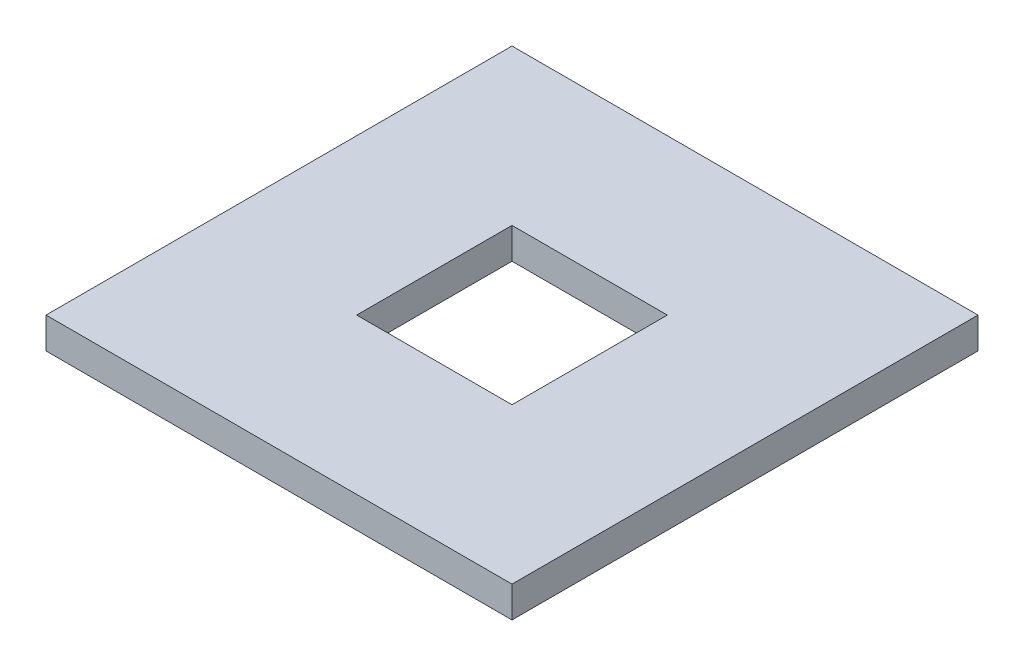
ISO-10303-21;
HEADER;
FILE_DESCRIPTION(('STEP AP214'),'2;1');
FILE_NAME('part.step','',(''),(''),'','','');
FILE_SCHEMA(('AUTOMOTIVE_DESIGN { 1 0 10303 214 1 1 1 1 }'));
ENDSEC;
DATA;
#1=APPLICATION_CONTEXT('core data for automotive mechanical design processes');
#2=APPLICATION_PROTOCOL_DEFINITION('international standard','automotive_design',2000,#1);
#3=PRODUCT_CONTEXT('',#1,'mechanical');
#4=PRODUCT('Part','Part','',(#3));
#5=PRODUCT_RELATED_PRODUCT_CATEGORY('part','',(#4));
#6=PRODUCT_DEFINITION_FORMATION('','',#4);
#7=PRODUCT_DEFINITION_CONTEXT('part definition',#1,'design');
#8=PRODUCT_DEFINITION('design','',#6,#7);
#9=PRODUCT_DEFINITION_SHAPE('','',#8);
#10=(LENGTH_UNIT() NAMED_UNIT(*) SI_UNIT(.MILLI.,.METRE.));
#11=(NAMED_UNIT(*) PLANE_ANGLE_UNIT() SI_UNIT($,.RADIAN.));
#12=(NAMED_UNIT(*) SI_UNIT($,.STERADIAN.) SOLID_ANGLE_UNIT());
#13=UNCERTAINTY_MEASURE_WITH_UNIT(LENGTH_MEASURE(1.E-05),#10,'distance_accuracy_value','');
#14=(GEOMETRIC_REPRESENTATION_CONTEXT(3) GLOBAL_UNCERTAINTY_ASSIGNED_CONTEXT((#13)) GLOBAL_UNIT_ASSIGNED_CONTEXT((#10,
#11,#12)) REPRESENTATION_CONTEXT('',''));
#15=CARTESIAN_POINT('',(0.,0.,0.));
#16=DIRECTION('',(0.,0.,1.));
#17=DIRECTION('',(1.,0.,0.));
#18=AXIS2_PLACEMENT_3D('',#15,#16,#17);
#19=CARTESIAN_POINT('',(0.,100.,-1000.));
#20=DIRECTION('',(0.,0.,-1.));
#21=DIRECTION('',(-1.,0.,0.));
#22=AXIS2_PLACEMENT_3D('',#19,#20,#21);
#23=PLANE('',#22);
#24=DIRECTION('',(1.,0.,0.));
#25=VECTOR('',#24,1.);
#26=CARTESIAN_POINT('',(0.,0.,-1000.));
#27=LINE('',#26,#25);
#28=CARTESIAN_POINT('',(500.,0.,-1000.));
#29=VERTEX_POINT('',#28);
#30=CARTESIAN_POINT('',(1000.,0.,-1000.));
#31=VERTEX_POINT('',#30);
#32=EDGE_CURVE('E146',#29,#31,#27,.T.);
#33=ORIENTED_EDGE('',*,*,#32,.T.);
#34=DIRECTION('',(0.,-1.,0.));
#35=VECTOR('',#34,1.);
#36=CARTESIAN_POINT('',(1000.,100.,-1000.));
#37=LINE('',#36,#35);
#38=CARTESIAN_POINT('',(1000.,100.,-1000.));
#39=VERTEX_POINT('',#38);
#40=EDGE_CURVE('E11',#39,#31,#37,.T.);
#41=ORIENTED_EDGE('',*,*,#40,.F.);
#42=DIRECTION('',(1.,0.,0.));
#43=VECTOR('',#42,1.);
#44=CARTESIAN_POINT('',(0.,100.,-1000.));
#45=LINE('',#44,#43);
#46=CARTESIAN_POINT('',(500.,100.,-1000.));
#47=VERTEX_POINT('',#46);
#48=EDGE_CURVE('E117',#47,#39,#45,.T.);
#49=ORIENTED_EDGE('',*,*,#48,.F.);
#50=DIRECTION('',(0.,-1.,0.));
#51=VECTOR('',#50,1.);
#52=CARTESIAN_POINT('',(500.,100.,-1000.));
#53=LINE('',#52,#51);
#54=EDGE_CURVE('E56',#47,#29,#53,.T.);
#55=ORIENTED_EDGE('',*,*,#54,.T.);
#56=EDGE_LOOP('',(#33,#41,#49,#55));
#57=FACE_BOUND('',#56,.T.);
#58=ADVANCED_FACE('F37',(#57),#23,.F.);
#59=CARTESIAN_POINT('',(1000.,100.,0.));
#60=DIRECTION('',(1.,0.,0.));
#61=DIRECTION('',(0.,0.,-1.));
#62=AXIS2_PLACEMENT_3D('',#59,#60,#61);
#63=PLANE('',#62);
#64=DIRECTION('',(0.,0.,1.));
#65=VECTOR('',#64,1.);
#66=CARTESIAN_POINT('',(1000.,0.,0.));
#67=LINE('',#66,#65);
#68=CARTESIAN_POINT('',(1000.,0.,-500.));
#69=VERTEX_POINT('',#68);
#70=EDGE_CURVE('E123',#31,#69,#67,.T.);
#71=ORIENTED_EDGE('',*,*,#70,.T.);
#72=DIRECTION('',(0.,-1.,0.));
#73=VECTOR('',#72,1.);
#74=CARTESIAN_POINT('',(1000.,100.,-500.));
#75=LINE('',#74,#73);
#76=CARTESIAN_POINT('',(1000.,100.,-500.));
#77=VERTEX_POINT('',#76);
#78=EDGE_CURVE('E47',#77,#69,#75,.T.);
#79=ORIENTED_EDGE('',*,*,#78,.F.);
#80=DIRECTION('',(0.,0.,1.));
#81=VECTOR('',#80,1.);
#82=CARTESIAN_POINT('',(1000.,100.,0.));
#83=LINE('',#82,#81);
#84=EDGE_CURVE('E111',#39,#77,#83,.T.);
#85=ORIENTED_EDGE('',*,*,#84,.F.);
#86=ORIENTED_EDGE('',*,*,#40,.T.);
#87=EDGE_LOOP('',(#71,#79,#85,#86));
#88=FACE_BOUND('',#87,.T.);
#89=ADVANCED_FACE('F122',(#88),#63,.F.);
#90=CARTESIAN_POINT('',(0.,100.,-500.));
#91=DIRECTION('',(0.,0.,-1.));
#92=DIRECTION('',(-1.,0.,0.));
#93=AXIS2_PLACEMENT_3D('',#90,#91,#92);
#94=PLANE('',#93);
#95=DIRECTION('',(1.,0.,0.));
#96=VECTOR('',#95,1.);
#97=CARTESIAN_POINT('',(0.,0.,-500.));
#98=LINE('',#97,#96);
#99=CARTESIAN_POINT('',(500.,0.,-500.));
#100=VERTEX_POINT('',#99);
#101=EDGE_CURVE('E149',#100,#69,#98,.T.);
#102=ORIENTED_EDGE('',*,*,#101,.F.);
#103=DIRECTION('',(0.,-1.,0.));
#104=VECTOR('',#103,1.);
#105=CARTESIAN_POINT('',(500.,100.,-500.));
#106=LINE('',#105,#104);
#107=CARTESIAN_POINT('',(500.,100.,-500.));
#108=VERTEX_POINT('',#107);
#109=EDGE_CURVE('E82',#108,#100,#106,.T.);
#110=ORIENTED_EDGE('',*,*,#109,.F.);
#111=DIRECTION('',(1.,0.,0.));
#112=VECTOR('',#111,1.);
#113=CARTESIAN_POINT('',(0.,100.,-500.));
#114=LINE('',#113,#112);
#115=EDGE_CURVE('E116',#108,#77,#114,.T.);
#116=ORIENTED_EDGE('',*,*,#115,.T.);
#117=ORIENTED_EDGE('',*,*,#78,.T.);
#118=EDGE_LOOP('',(#102,#110,#116,#117));
#119=FACE_BOUND('',#118,.T.);
#120=ADVANCED_FACE('F127',(#119),#94,.T.);
#121=CARTESIAN_POINT('',(0.,100.,0.));
#122=DIRECTION('',(0.,0.,-1.));
#123=DIRECTION('',(-1.,0.,0.));
#124=AXIS2_PLACEMENT_3D('',#121,#122,#123);
#125=PLANE('',#124);
#126=DIRECTION('',(1.,0.,0.));
#127=VECTOR('',#126,1.);
#128=CARTESIAN_POINT('',(0.,0.,0.));
#129=LINE('',#128,#127);
#130=CARTESIAN_POINT('',(0.,0.,0.));
#131=VERTEX_POINT('',#130);
#132=CARTESIAN_POINT('',(1500.,0.,0.));
#133=VERTEX_POINT('',#132);
#134=EDGE_CURVE('E134',#131,#133,#129,.T.);
#135=ORIENTED_EDGE('',*,*,#134,.T.);
#136=DIRECTION('',(0.,-1.,0.));
#137=VECTOR('',#136,1.);
#138=CARTESIAN_POINT('',(1500.,100.,0.));
#139=LINE('',#138,#137);
#140=CARTESIAN_POINT('',(1500.,100.,0.));
#141=VERTEX_POINT('',#140);
#142=EDGE_CURVE('E41',#141,#133,#139,.T.);
#143=ORIENTED_EDGE('',*,*,#142,.F.);
#144=DIRECTION('',(1.,0.,0.));
#145=VECTOR('',#144,1.);
#146=CARTESIAN_POINT('',(0.,100.,0.));
#147=LINE('',#146,#145);
#148=CARTESIAN_POINT('',(0.,100.,0.));
#149=VERTEX_POINT('',#148);
#150=EDGE_CURVE('E154',#149,#141,#147,.T.);
#151=ORIENTED_EDGE('',*,*,#150,.F.);
#152=DIRECTION('',(0.,-1.,0.));
#153=VECTOR('',#152,1.);
#154=CARTESIAN_POINT('',(0.,100.,0.));
#155=LINE('',#154,#153);
#156=EDGE_CURVE('E130',#149,#131,#155,.T.);
#157=ORIENTED_EDGE('',*,*,#156,.T.);
#158=EDGE_LOOP('',(#135,#143,#151,#157));
#159=FACE_BOUND('',#158,.T.);
#160=ADVANCED_FACE('F39',(#159),#125,.F.);
#161=CARTESIAN_POINT('',(1500.,100.,0.));
#162=DIRECTION('',(-1.,0.,0.));
#163=DIRECTION('',(0.,0.,1.));
#164=AXIS2_PLACEMENT_3D('',#161,#162,#163);
#165=PLANE('',#164);
#166=DIRECTION('',(0.,0.,-1.));
#167=VECTOR('',#166,1.);
#168=CARTESIAN_POINT('',(1500.,0.,0.));
#169=LINE('',#168,#167);
#170=CARTESIAN_POINT('',(1500.,0.,-1500.));
#171=VERTEX_POINT('',#170);
#172=EDGE_CURVE('E137',#133,#171,#169,.T.);
#173=ORIENTED_EDGE('',*,*,#172,.T.);
#174=DIRECTION('',(0.,-1.,0.));
#175=VECTOR('',#174,1.);
#176=CARTESIAN_POINT('',(1500.,100.,-1500.));
#177=LINE('',#176,#175);
#178=CARTESIAN_POINT('',(1500.,100.,-1500.));
#179=VERTEX_POINT('',#178);
#180=EDGE_CURVE('E159',#179,#171,#177,.T.);
#181=ORIENTED_EDGE('',*,*,#180,.F.);
#182=DIRECTION('',(0.,0.,-1.));
#183=VECTOR('',#182,1.);
#184=CARTESIAN_POINT('',(1500.,100.,0.));
#185=LINE('',#184,#183);
#186=EDGE_CURVE('E95',#141,#179,#185,.T.);
#187=ORIENTED_EDGE('',*,*,#186,.F.);
#188=ORIENTED_EDGE('',*,*,#142,.T.);
#189=EDGE_LOOP('',(#173,#181,#187,#188));
#190=FACE_BOUND('',#189,.T.);
#191=ADVANCED_FACE('F164',(#190),#165,.F.);
#192=CARTESIAN_POINT('',(0.,100.,-1500.));
#193=DIRECTION('',(0.,0.,-1.));
#194=DIRECTION('',(-1.,0.,0.));
#195=AXIS2_PLACEMENT_3D('',#192,#193,#194);
#196=PLANE('',#195);
#197=DIRECTION('',(1.,0.,0.));
#198=VECTOR('',#197,1.);
#199=CARTESIAN_POINT('',(0.,0.,-1500.));
#200=LINE('',#199,#198);
#201=CARTESIAN_POINT('',(0.,0.,-1500.));
#202=VERTEX_POINT('',#201);
#203=EDGE_CURVE('E140',#202,#171,#200,.T.);
#204=ORIENTED_EDGE('',*,*,#203,.F.);
#205=DIRECTION('',(0.,-1.,0.));
#206=VECTOR('',#205,1.);
#207=CARTESIAN_POINT('',(0.,100.,-1500.));
#208=LINE('',#207,#206);
#209=CARTESIAN_POINT('',(0.,100.,-1500.));
#210=VERTEX_POINT('',#209);
#211=EDGE_CURVE('E158',#210,#202,#208,.T.);
#212=ORIENTED_EDGE('',*,*,#211,.F.);
#213=DIRECTION('',(1.,0.,0.));
#214=VECTOR('',#213,1.);
#215=CARTESIAN_POINT('',(0.,100.,-1500.));
#216=LINE('',#215,#214);
#217=EDGE_CURVE('E205',#210,#179,#216,.T.);
#218=ORIENTED_EDGE('',*,*,#217,.T.);
#219=ORIENTED_EDGE('',*,*,#180,.T.);
#220=EDGE_LOOP('',(#204,#212,#218,#219));
#221=FACE_BOUND('',#220,.T.);
#222=ADVANCED_FACE('F178',(#221),#196,.T.);
#223=CARTESIAN_POINT('',(0.,100.,0.));
#224=DIRECTION('',(-1.,0.,0.));
#225=DIRECTION('',(0.,0.,1.));
#226=AXIS2_PLACEMENT_3D('',#223,#224,#225);
#227=PLANE('',#226);
#228=DIRECTION('',(0.,0.,-1.));
#229=VECTOR('',#228,1.);
#230=CARTESIAN_POINT('',(0.,0.,0.));
#231=LINE('',#230,#229);
#232=EDGE_CURVE('E143',#131,#202,#231,.T.);
#233=ORIENTED_EDGE('',*,*,#232,.F.);
#234=ORIENTED_EDGE('',*,*,#156,.F.);
#235=DIRECTION('',(0.,0.,-1.));
#236=VECTOR('',#235,1.);
#237=CARTESIAN_POINT('',(0.,100.,0.));
#238=LINE('',#237,#236);
#239=EDGE_CURVE('E176',#149,#210,#238,.T.);
#240=ORIENTED_EDGE('',*,*,#239,.T.);
#241=ORIENTED_EDGE('',*,*,#211,.T.);
#242=EDGE_LOOP('',(#233,#234,#240,#241));
#243=FACE_BOUND('',#242,.T.);
#244=ADVANCED_FACE('F173',(#243),#227,.T.);
#245=CARTESIAN_POINT('',(500.,100.,-2.22044604925031E-13));
#246=DIRECTION('',(1.,0.,0.));
#247=DIRECTION('',(0.,0.,-1.));
#248=AXIS2_PLACEMENT_3D('',#245,#246,#247);
#249=PLANE('',#248);
#250=DIRECTION('',(0.,0.,1.));
#251=VECTOR('',#250,1.);
#252=CARTESIAN_POINT('',(500.,0.,-2.22044604925031E-13));
#253=LINE('',#252,#251);
#254=EDGE_CURVE('E151',#29,#100,#253,.T.);
#255=ORIENTED_EDGE('',*,*,#254,.F.);
#256=ORIENTED_EDGE('',*,*,#54,.F.);
#257=DIRECTION('',(0.,0.,1.));
#258=VECTOR('',#257,1.);
#259=CARTESIAN_POINT('',(500.,100.,-2.22044604925031E-13));
#260=LINE('',#259,#258);
#261=EDGE_CURVE('E128',#47,#108,#260,.T.);
#262=ORIENTED_EDGE('',*,*,#261,.T.);
#263=ORIENTED_EDGE('',*,*,#109,.T.);
#264=EDGE_LOOP('',(#255,#256,#262,#263));
#265=FACE_BOUND('',#264,.T.);
#266=ADVANCED_FACE('F185',(#265),#249,.T.);
#267=CARTESIAN_POINT('',(0.,100.,0.));
#268=DIRECTION('',(0.,1.,0.));
#269=DIRECTION('',(0.,0.,1.));
#270=AXIS2_PLACEMENT_3D('',#267,#268,#269);
#271=PLANE('',#270);
#272=ORIENTED_EDGE('',*,*,#150,.T.);
#273=ORIENTED_EDGE('',*,*,#186,.T.);
#274=ORIENTED_EDGE('',*,*,#217,.F.);
#275=ORIENTED_EDGE('',*,*,#239,.F.);
#276=EDGE_LOOP('',(#272,#273,#274,#275));
#277=FACE_BOUND('',#276,.T.);
#278=ORIENTED_EDGE('',*,*,#48,.T.);
#279=ORIENTED_EDGE('',*,*,#84,.T.);
#280=ORIENTED_EDGE('',*,*,#115,.F.);
#281=ORIENTED_EDGE('',*,*,#261,.F.);
#282=EDGE_LOOP('',(#278,#279,#280,#281));
#283=FACE_BOUND('',#282,.T.);
#284=ADVANCED_FACE('F113',(#277,#283),#271,.T.);
#285=CARTESIAN_POINT('',(0.,0.,0.));
#286=DIRECTION('',(0.,1.,0.));
#287=DIRECTION('',(0.,0.,1.));
#288=AXIS2_PLACEMENT_3D('',#285,#286,#287);
#289=PLANE('',#288);
#290=ORIENTED_EDGE('',*,*,#134,.F.);
#291=ORIENTED_EDGE('',*,*,#232,.T.);
#292=ORIENTED_EDGE('',*,*,#203,.T.);
#293=ORIENTED_EDGE('',*,*,#172,.F.);
#294=EDGE_LOOP('',(#290,#291,#292,#293));
#295=FACE_BOUND('',#294,.T.);
#296=ORIENTED_EDGE('',*,*,#32,.F.);
#297=ORIENTED_EDGE('',*,*,#254,.T.);
#298=ORIENTED_EDGE('',*,*,#101,.T.);
#299=ORIENTED_EDGE('',*,*,#70,.F.);
#300=EDGE_LOOP('',(#296,#297,#298,#299));
#301=FACE_BOUND('',#300,.T.);
#302=ADVANCED_FACE('F170',(#295,#301),#289,.F.);
#303=CLOSED_SHELL('',(#58,#89,#120,#160,#191,#222,#244,#266,#284,#302));
#304=MANIFOLD_SOLID_BREP('B2',#303);
#305=ADVANCED_BREP_SHAPE_REPRESENTATION('',(#18,#304),#14);
#306=SHAPE_DEFINITION_REPRESENTATION(#9,#305);
ENDSEC;
END-ISO-10303-21;
